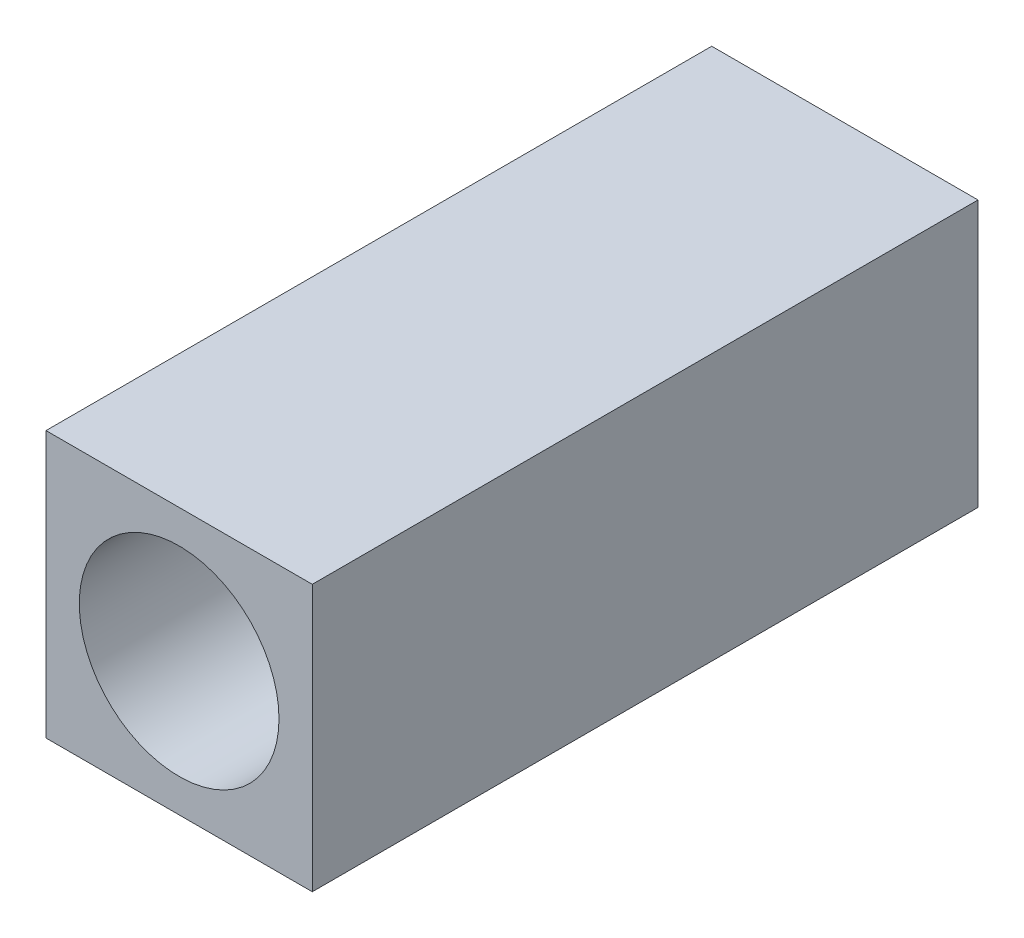
ISO-10303-21;
HEADER;
FILE_DESCRIPTION(('STEP AP214'),'2;1');
FILE_NAME('part.step','',(''),(''),'','','');
FILE_SCHEMA(('AUTOMOTIVE_DESIGN { 1 0 10303 214 1 1 1 1 }'));
ENDSEC;
DATA;
#1=APPLICATION_CONTEXT('core data for automotive mechanical design processes');
#2=APPLICATION_PROTOCOL_DEFINITION('international standard','automotive_design',2000,#1);
#3=PRODUCT_CONTEXT('',#1,'mechanical');
#4=PRODUCT('Part','Part','',(#3));
#5=PRODUCT_RELATED_PRODUCT_CATEGORY('part','',(#4));
#6=PRODUCT_DEFINITION_FORMATION('','',#4);
#7=PRODUCT_DEFINITION_CONTEXT('part definition',#1,'design');
#8=PRODUCT_DEFINITION('design','',#6,#7);
#9=PRODUCT_DEFINITION_SHAPE('','',#8);
#10=(LENGTH_UNIT() NAMED_UNIT(*) SI_UNIT(.MILLI.,.METRE.));
#11=(NAMED_UNIT(*) PLANE_ANGLE_UNIT() SI_UNIT($,.RADIAN.));
#12=(NAMED_UNIT(*) SI_UNIT($,.STERADIAN.) SOLID_ANGLE_UNIT());
#13=UNCERTAINTY_MEASURE_WITH_UNIT(LENGTH_MEASURE(1.E-05),#10,'distance_accuracy_value','');
#14=(GEOMETRIC_REPRESENTATION_CONTEXT(3) GLOBAL_UNCERTAINTY_ASSIGNED_CONTEXT((#13)) GLOBAL_UNIT_ASSIGNED_CONTEXT((#10,
#11,#12)) REPRESENTATION_CONTEXT('',''));
#15=CARTESIAN_POINT('',(0.,0.,0.));
#16=DIRECTION('',(0.,0.,1.));
#17=DIRECTION('',(1.,0.,0.));
#18=AXIS2_PLACEMENT_3D('',#15,#16,#17);
#19=CARTESIAN_POINT('',(0.,0.,100.));
#20=DIRECTION('',(0.,0.,-1.));
#21=DIRECTION('',(-1.,0.,0.));
#22=AXIS2_PLACEMENT_3D('',#19,#20,#21);
#23=PLANE('',#22);
#24=DIRECTION('',(0.,1.,0.));
#25=VECTOR('',#24,1.);
#26=CARTESIAN_POINT('',(40.,-40.,100.));
#27=LINE('',#26,#25);
#28=CARTESIAN_POINT('',(40.,-40.,100.));
#29=VERTEX_POINT('',#28);
#30=CARTESIAN_POINT('',(40.,40.,100.));
#31=VERTEX_POINT('',#30);
#32=EDGE_CURVE('E93',#29,#31,#27,.T.);
#33=ORIENTED_EDGE('',*,*,#32,.T.);
#34=DIRECTION('',(-1.,0.,0.));
#35=VECTOR('',#34,1.);
#36=CARTESIAN_POINT('',(-40.,40.,100.));
#37=LINE('',#36,#35);
#38=CARTESIAN_POINT('',(-40.,40.,100.));
#39=VERTEX_POINT('',#38);
#40=EDGE_CURVE('E87',#31,#39,#37,.T.);
#41=ORIENTED_EDGE('',*,*,#40,.T.);
#42=DIRECTION('',(0.,-1.,0.));
#43=VECTOR('',#42,1.);
#44=CARTESIAN_POINT('',(-40.,-40.,100.));
#45=LINE('',#44,#43);
#46=CARTESIAN_POINT('',(-40.,-40.,100.));
#47=VERTEX_POINT('',#46);
#48=EDGE_CURVE('E86',#39,#47,#45,.T.);
#49=ORIENTED_EDGE('',*,*,#48,.T.);
#50=DIRECTION('',(1.,0.,0.));
#51=VECTOR('',#50,1.);
#52=CARTESIAN_POINT('',(-40.,-40.,100.));
#53=LINE('',#52,#51);
#54=EDGE_CURVE('E57',#47,#29,#53,.T.);
#55=ORIENTED_EDGE('',*,*,#54,.T.);
#56=EDGE_LOOP('',(#33,#41,#49,#55));
#57=FACE_BOUND('',#56,.T.);
#58=CARTESIAN_POINT('',(0.,0.,100.));
#59=DIRECTION('',(0.,0.,1.));
#60=DIRECTION('',(1.,0.,0.));
#61=AXIS2_PLACEMENT_3D('',#58,#59,#60);
#62=CIRCLE('',#61,30.);
#63=CARTESIAN_POINT('',(30.,0.,100.));
#64=VERTEX_POINT('',#63);
#65=EDGE_CURVE('E108',#64,#64,#62,.T.);
#66=ORIENTED_EDGE('',*,*,#65,.F.);
#67=EDGE_LOOP('',(#66));
#68=FACE_BOUND('',#67,.T.);
#69=ADVANCED_FACE('F39',(#57,#68),#23,.F.);
#70=CARTESIAN_POINT('',(0.,0.,-100.));
#71=DIRECTION('',(0.,0.,-1.));
#72=DIRECTION('',(-1.,0.,0.));
#73=AXIS2_PLACEMENT_3D('',#70,#71,#72);
#74=PLANE('',#73);
#75=DIRECTION('',(0.,1.,0.));
#76=VECTOR('',#75,1.);
#77=CARTESIAN_POINT('',(40.,-40.,-100.));
#78=LINE('',#77,#76);
#79=CARTESIAN_POINT('',(40.,-40.,-100.));
#80=VERTEX_POINT('',#79);
#81=CARTESIAN_POINT('',(40.,40.,-100.));
#82=VERTEX_POINT('',#81);
#83=EDGE_CURVE('E103',#80,#82,#78,.T.);
#84=ORIENTED_EDGE('',*,*,#83,.F.);
#85=DIRECTION('',(1.,0.,0.));
#86=VECTOR('',#85,1.);
#87=CARTESIAN_POINT('',(-40.,-40.,-100.));
#88=LINE('',#87,#86);
#89=CARTESIAN_POINT('',(-40.,-40.,-100.));
#90=VERTEX_POINT('',#89);
#91=EDGE_CURVE('E79',#90,#80,#88,.T.);
#92=ORIENTED_EDGE('',*,*,#91,.F.);
#93=DIRECTION('',(0.,-1.,0.));
#94=VECTOR('',#93,1.);
#95=CARTESIAN_POINT('',(-40.,-40.,-100.));
#96=LINE('',#95,#94);
#97=CARTESIAN_POINT('',(-40.,40.,-100.));
#98=VERTEX_POINT('',#97);
#99=EDGE_CURVE('E73',#98,#90,#96,.T.);
#100=ORIENTED_EDGE('',*,*,#99,.F.);
#101=DIRECTION('',(-1.,0.,0.));
#102=VECTOR('',#101,1.);
#103=CARTESIAN_POINT('',(-40.,40.,-100.));
#104=LINE('',#103,#102);
#105=EDGE_CURVE('E91',#82,#98,#104,.T.);
#106=ORIENTED_EDGE('',*,*,#105,.F.);
#107=EDGE_LOOP('',(#84,#92,#100,#106));
#108=FACE_BOUND('',#107,.T.);
#109=CARTESIAN_POINT('',(0.,0.,-100.));
#110=DIRECTION('',(0.,0.,1.));
#111=DIRECTION('',(1.,0.,0.));
#112=AXIS2_PLACEMENT_3D('',#109,#110,#111);
#113=CIRCLE('',#112,30.);
#114=CARTESIAN_POINT('',(30.,0.,-100.));
#115=VERTEX_POINT('',#114);
#116=EDGE_CURVE('E118',#115,#115,#113,.T.);
#117=ORIENTED_EDGE('',*,*,#116,.T.);
#118=EDGE_LOOP('',(#117));
#119=FACE_BOUND('',#118,.T.);
#120=ADVANCED_FACE('F114',(#108,#119),#74,.T.);
#121=CARTESIAN_POINT('',(40.,-40.,100.));
#122=DIRECTION('',(-1.,0.,0.));
#123=DIRECTION('',(0.,0.,1.));
#124=AXIS2_PLACEMENT_3D('',#121,#122,#123);
#125=PLANE('',#124);
#126=ORIENTED_EDGE('',*,*,#83,.T.);
#127=DIRECTION('',(0.,0.,-1.));
#128=VECTOR('',#127,1.);
#129=CARTESIAN_POINT('',(40.,40.,100.));
#130=LINE('',#129,#128);
#131=EDGE_CURVE('E11',#31,#82,#130,.T.);
#132=ORIENTED_EDGE('',*,*,#131,.F.);
#133=ORIENTED_EDGE('',*,*,#32,.F.);
#134=DIRECTION('',(0.,0.,-1.));
#135=VECTOR('',#134,1.);
#136=CARTESIAN_POINT('',(40.,-40.,100.));
#137=LINE('',#136,#135);
#138=EDGE_CURVE('E99',#29,#80,#137,.T.);
#139=ORIENTED_EDGE('',*,*,#138,.T.);
#140=EDGE_LOOP('',(#126,#132,#133,#139));
#141=FACE_BOUND('',#140,.T.);
#142=ADVANCED_FACE('F41',(#141),#125,.F.);
#143=CARTESIAN_POINT('',(-40.,40.,100.));
#144=DIRECTION('',(0.,-1.,0.));
#145=DIRECTION('',(0.,0.,-1.));
#146=AXIS2_PLACEMENT_3D('',#143,#144,#145);
#147=PLANE('',#146);
#148=ORIENTED_EDGE('',*,*,#105,.T.);
#149=DIRECTION('',(0.,0.,-1.));
#150=VECTOR('',#149,1.);
#151=CARTESIAN_POINT('',(-40.,40.,100.));
#152=LINE('',#151,#150);
#153=EDGE_CURVE('E48',#39,#98,#152,.T.);
#154=ORIENTED_EDGE('',*,*,#153,.F.);
#155=ORIENTED_EDGE('',*,*,#40,.F.);
#156=ORIENTED_EDGE('',*,*,#131,.T.);
#157=EDGE_LOOP('',(#148,#154,#155,#156));
#158=FACE_BOUND('',#157,.T.);
#159=ADVANCED_FACE('F95',(#158),#147,.F.);
#160=CARTESIAN_POINT('',(-40.,-40.,100.));
#161=DIRECTION('',(1.,0.,0.));
#162=DIRECTION('',(0.,0.,-1.));
#163=AXIS2_PLACEMENT_3D('',#160,#161,#162);
#164=PLANE('',#163);
#165=ORIENTED_EDGE('',*,*,#99,.T.);
#166=DIRECTION('',(0.,0.,-1.));
#167=VECTOR('',#166,1.);
#168=CARTESIAN_POINT('',(-40.,-40.,100.));
#169=LINE('',#168,#167);
#170=EDGE_CURVE('E97',#47,#90,#169,.T.);
#171=ORIENTED_EDGE('',*,*,#170,.F.);
#172=ORIENTED_EDGE('',*,*,#48,.F.);
#173=ORIENTED_EDGE('',*,*,#153,.T.);
#174=EDGE_LOOP('',(#165,#171,#172,#173));
#175=FACE_BOUND('',#174,.T.);
#176=ADVANCED_FACE('F100',(#175),#164,.F.);
#177=CARTESIAN_POINT('',(-40.,-40.,100.));
#178=DIRECTION('',(0.,1.,0.));
#179=DIRECTION('',(0.,0.,1.));
#180=AXIS2_PLACEMENT_3D('',#177,#178,#179);
#181=PLANE('',#180);
#182=ORIENTED_EDGE('',*,*,#91,.T.);
#183=ORIENTED_EDGE('',*,*,#138,.F.);
#184=ORIENTED_EDGE('',*,*,#54,.F.);
#185=ORIENTED_EDGE('',*,*,#170,.T.);
#186=EDGE_LOOP('',(#182,#183,#184,#185));
#187=FACE_BOUND('',#186,.T.);
#188=ADVANCED_FACE('F113',(#187),#181,.F.);
#189=CARTESIAN_POINT('',(0.,0.,100.));
#190=DIRECTION('',(0.,0.,-1.));
#191=DIRECTION('',(-1.,0.,0.));
#192=AXIS2_PLACEMENT_3D('',#189,#190,#191);
#193=CYLINDRICAL_SURFACE('',#192,30.);
#194=ORIENTED_EDGE('',*,*,#65,.T.);
#195=EDGE_LOOP('',(#194));
#196=FACE_BOUND('',#195,.T.);
#197=ORIENTED_EDGE('',*,*,#116,.F.);
#198=EDGE_LOOP('',(#197));
#199=FACE_BOUND('',#198,.T.);
#200=ADVANCED_FACE('F122',(#196,#199),#193,.F.);
#201=CLOSED_SHELL('',(#69,#120,#142,#159,#176,#188,#200));
#202=MANIFOLD_SOLID_BREP('B2',#201);
#203=ADVANCED_BREP_SHAPE_REPRESENTATION('',(#18,#202),#14);
#204=SHAPE_DEFINITION_REPRESENTATION(#9,#203);
ENDSEC;
END-ISO-10303-21;
